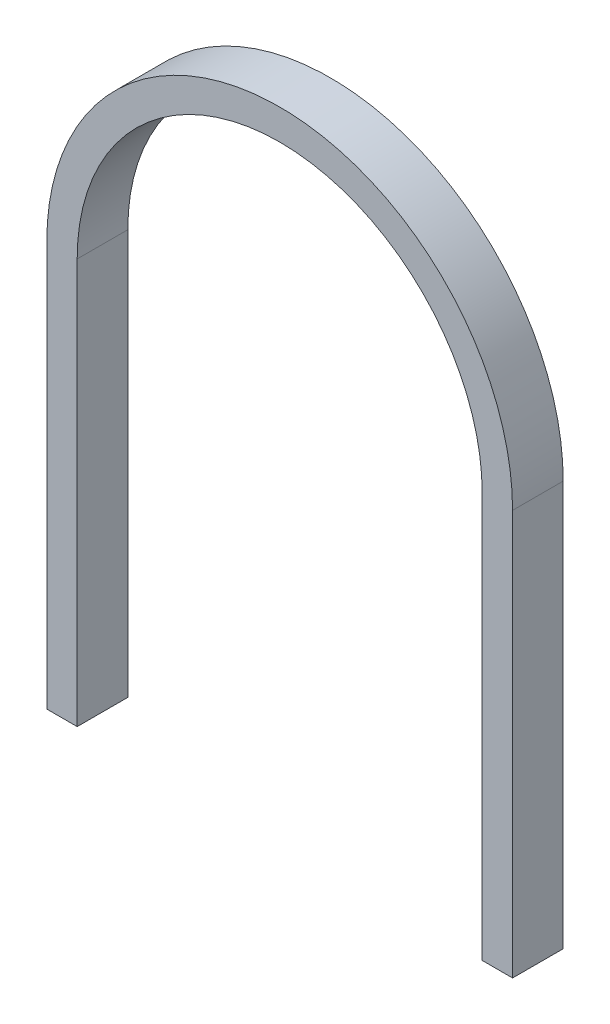
ISO-10303-21;
HEADER;
FILE_DESCRIPTION(('STEP AP214'),'2;1');
FILE_NAME('part.step','',(''),(''),'','','');
FILE_SCHEMA(('AUTOMOTIVE_DESIGN { 1 0 10303 214 1 1 1 1 }'));
ENDSEC;
DATA;
#1=APPLICATION_CONTEXT('core data for automotive mechanical design processes');
#2=APPLICATION_PROTOCOL_DEFINITION('international standard','automotive_design',2000,#1);
#3=PRODUCT_CONTEXT('',#1,'mechanical');
#4=PRODUCT('Part','Part','',(#3));
#5=PRODUCT_RELATED_PRODUCT_CATEGORY('part','',(#4));
#6=PRODUCT_DEFINITION_FORMATION('','',#4);
#7=PRODUCT_DEFINITION_CONTEXT('part definition',#1,'design');
#8=PRODUCT_DEFINITION('design','',#6,#7);
#9=PRODUCT_DEFINITION_SHAPE('','',#8);
#10=(LENGTH_UNIT() NAMED_UNIT(*) SI_UNIT(.MILLI.,.METRE.));
#11=(NAMED_UNIT(*) PLANE_ANGLE_UNIT() SI_UNIT($,.RADIAN.));
#12=(NAMED_UNIT(*) SI_UNIT($,.STERADIAN.) SOLID_ANGLE_UNIT());
#13=UNCERTAINTY_MEASURE_WITH_UNIT(LENGTH_MEASURE(1.E-05),#10,'distance_accuracy_value','');
#14=(GEOMETRIC_REPRESENTATION_CONTEXT(3) GLOBAL_UNCERTAINTY_ASSIGNED_CONTEXT((#13)) GLOBAL_UNIT_ASSIGNED_CONTEXT((#10,
#11,#12)) REPRESENTATION_CONTEXT('',''));
#15=CARTESIAN_POINT('',(0.,0.,0.));
#16=DIRECTION('',(0.,0.,1.));
#17=DIRECTION('',(1.,0.,0.));
#18=AXIS2_PLACEMENT_3D('',#15,#16,#17);
#19=CARTESIAN_POINT('',(-20.,0.,5.));
#20=DIRECTION('',(0.,1.,0.));
#21=DIRECTION('',(-1.,0.,0.));
#22=AXIS2_PLACEMENT_3D('',#19,#20,#21);
#23=PLANE('',#22);
#24=DIRECTION('',(1.,0.,0.));
#25=VECTOR('',#24,1.);
#26=CARTESIAN_POINT('',(-20.,0.,0.));
#27=LINE('',#26,#25);
#28=CARTESIAN_POINT('',(-23.,0.,0.));
#29=VERTEX_POINT('',#28);
#30=CARTESIAN_POINT('',(-20.,0.,0.));
#31=VERTEX_POINT('',#30);
#32=EDGE_CURVE('E129',#29,#31,#27,.T.);
#33=ORIENTED_EDGE('',*,*,#32,.T.);
#34=DIRECTION('',(0.,0.,-1.));
#35=VECTOR('',#34,1.);
#36=CARTESIAN_POINT('',(-20.,0.,5.));
#37=LINE('',#36,#35);
#38=CARTESIAN_POINT('',(-20.,0.,5.));
#39=VERTEX_POINT('',#38);
#40=EDGE_CURVE('E11',#39,#31,#37,.T.);
#41=ORIENTED_EDGE('',*,*,#40,.F.);
#42=DIRECTION('',(1.,0.,0.));
#43=VECTOR('',#42,1.);
#44=CARTESIAN_POINT('',(-20.,0.,5.));
#45=LINE('',#44,#43);
#46=CARTESIAN_POINT('',(-23.,0.,5.));
#47=VERTEX_POINT('',#46);
#48=EDGE_CURVE('E143',#47,#39,#45,.T.);
#49=ORIENTED_EDGE('',*,*,#48,.F.);
#50=DIRECTION('',(0.,0.,-1.));
#51=VECTOR('',#50,1.);
#52=CARTESIAN_POINT('',(-23.,0.,5.));
#53=LINE('',#52,#51);
#54=EDGE_CURVE('E125',#47,#29,#53,.T.);
#55=ORIENTED_EDGE('',*,*,#54,.T.);
#56=EDGE_LOOP('',(#33,#41,#49,#55));
#57=FACE_BOUND('',#56,.T.);
#58=ADVANCED_FACE('F33',(#57),#23,.F.);
#59=CARTESIAN_POINT('',(-20.,0.,5.));
#60=DIRECTION('',(-1.,0.,0.));
#61=DIRECTION('',(0.,-1.,0.));
#62=AXIS2_PLACEMENT_3D('',#59,#60,#61);
#63=PLANE('',#62);
#64=DIRECTION('',(0.,1.,0.));
#65=VECTOR('',#64,1.);
#66=CARTESIAN_POINT('',(-20.,0.,0.));
#67=LINE('',#66,#65);
#68=CARTESIAN_POINT('',(-20.,40.,0.));
#69=VERTEX_POINT('',#68);
#70=EDGE_CURVE('E132',#31,#69,#67,.T.);
#71=ORIENTED_EDGE('',*,*,#70,.T.);
#72=DIRECTION('',(0.,0.,-1.));
#73=VECTOR('',#72,1.);
#74=CARTESIAN_POINT('',(-20.,40.,5.));
#75=LINE('',#74,#73);
#76=CARTESIAN_POINT('',(-20.,40.,5.));
#77=VERTEX_POINT('',#76);
#78=EDGE_CURVE('E41',#77,#69,#75,.T.);
#79=ORIENTED_EDGE('',*,*,#78,.F.);
#80=DIRECTION('',(0.,1.,0.));
#81=VECTOR('',#80,1.);
#82=CARTESIAN_POINT('',(-20.,0.,5.));
#83=LINE('',#82,#81);
#84=EDGE_CURVE('E92',#39,#77,#83,.T.);
#85=ORIENTED_EDGE('',*,*,#84,.F.);
#86=ORIENTED_EDGE('',*,*,#40,.T.);
#87=EDGE_LOOP('',(#71,#79,#85,#86));
#88=FACE_BOUND('',#87,.T.);
#89=ADVANCED_FACE('F178',(#88),#63,.F.);
#90=CARTESIAN_POINT('',(0.,40.,5.));
#91=DIRECTION('',(0.,0.,-1.));
#92=DIRECTION('',(-1.,0.,0.));
#93=AXIS2_PLACEMENT_3D('',#90,#91,#92);
#94=CYLINDRICAL_SURFACE('',#93,20.);
#95=CARTESIAN_POINT('',(0.,40.,0.));
#96=DIRECTION('',(0.,0.,-1.));
#97=DIRECTION('',(-1.,0.,0.));
#98=AXIS2_PLACEMENT_3D('',#95,#96,#97);
#99=CIRCLE('',#98,20.);
#100=CARTESIAN_POINT('',(20.,40.,0.));
#101=VERTEX_POINT('',#100);
#102=EDGE_CURVE('E134',#69,#101,#99,.T.);
#103=ORIENTED_EDGE('',*,*,#102,.T.);
#104=DIRECTION('',(0.,0.,-1.));
#105=VECTOR('',#104,1.);
#106=CARTESIAN_POINT('',(20.,40.,5.));
#107=LINE('',#106,#105);
#108=CARTESIAN_POINT('',(20.,40.,5.));
#109=VERTEX_POINT('',#108);
#110=EDGE_CURVE('E150',#109,#101,#107,.T.);
#111=ORIENTED_EDGE('',*,*,#110,.F.);
#112=CARTESIAN_POINT('',(0.,40.,5.));
#113=DIRECTION('',(0.,0.,-1.));
#114=DIRECTION('',(-1.,0.,0.));
#115=AXIS2_PLACEMENT_3D('',#112,#113,#114);
#116=CIRCLE('',#115,20.);
#117=EDGE_CURVE('E158',#77,#109,#116,.T.);
#118=ORIENTED_EDGE('',*,*,#117,.F.);
#119=ORIENTED_EDGE('',*,*,#78,.T.);
#120=EDGE_LOOP('',(#103,#111,#118,#119));
#121=FACE_BOUND('',#120,.T.);
#122=ADVANCED_FACE('F156',(#121),#94,.F.);
#123=CARTESIAN_POINT('',(20.,40.,5.));
#124=DIRECTION('',(1.,0.,0.));
#125=DIRECTION('',(0.,1.,0.));
#126=AXIS2_PLACEMENT_3D('',#123,#124,#125);
#127=PLANE('',#126);
#128=DIRECTION('',(0.,-1.,0.));
#129=VECTOR('',#128,1.);
#130=CARTESIAN_POINT('',(20.,40.,0.));
#131=LINE('',#130,#129);
#132=CARTESIAN_POINT('',(20.,0.,0.));
#133=VERTEX_POINT('',#132);
#134=EDGE_CURVE('E136',#101,#133,#131,.T.);
#135=ORIENTED_EDGE('',*,*,#134,.T.);
#136=DIRECTION('',(0.,0.,-1.));
#137=VECTOR('',#136,1.);
#138=CARTESIAN_POINT('',(20.,0.,5.));
#139=LINE('',#138,#137);
#140=CARTESIAN_POINT('',(20.,0.,5.));
#141=VERTEX_POINT('',#140);
#142=EDGE_CURVE('E147',#141,#133,#139,.T.);
#143=ORIENTED_EDGE('',*,*,#142,.F.);
#144=DIRECTION('',(0.,-1.,0.));
#145=VECTOR('',#144,1.);
#146=CARTESIAN_POINT('',(20.,40.,5.));
#147=LINE('',#146,#145);
#148=EDGE_CURVE('E170',#109,#141,#147,.T.);
#149=ORIENTED_EDGE('',*,*,#148,.F.);
#150=ORIENTED_EDGE('',*,*,#110,.T.);
#151=EDGE_LOOP('',(#135,#143,#149,#150));
#152=FACE_BOUND('',#151,.T.);
#153=ADVANCED_FACE('F166',(#152),#127,.F.);
#154=CARTESIAN_POINT('',(20.,0.,5.));
#155=DIRECTION('',(0.,1.,0.));
#156=DIRECTION('',(-1.,0.,0.));
#157=AXIS2_PLACEMENT_3D('',#154,#155,#156);
#158=PLANE('',#157);
#159=DIRECTION('',(1.,0.,0.));
#160=VECTOR('',#159,1.);
#161=CARTESIAN_POINT('',(20.,0.,0.));
#162=LINE('',#161,#160);
#163=CARTESIAN_POINT('',(23.,0.,0.));
#164=VERTEX_POINT('',#163);
#165=EDGE_CURVE('E138',#133,#164,#162,.T.);
#166=ORIENTED_EDGE('',*,*,#165,.T.);
#167=DIRECTION('',(0.,0.,-1.));
#168=VECTOR('',#167,1.);
#169=CARTESIAN_POINT('',(23.,0.,5.));
#170=LINE('',#169,#168);
#171=CARTESIAN_POINT('',(23.,0.,5.));
#172=VERTEX_POINT('',#171);
#173=EDGE_CURVE('E120',#172,#164,#170,.T.);
#174=ORIENTED_EDGE('',*,*,#173,.F.);
#175=DIRECTION('',(1.,0.,0.));
#176=VECTOR('',#175,1.);
#177=CARTESIAN_POINT('',(20.,0.,5.));
#178=LINE('',#177,#176);
#179=EDGE_CURVE('E111',#141,#172,#178,.T.);
#180=ORIENTED_EDGE('',*,*,#179,.F.);
#181=ORIENTED_EDGE('',*,*,#142,.T.);
#182=EDGE_LOOP('',(#166,#174,#180,#181));
#183=FACE_BOUND('',#182,.T.);
#184=ADVANCED_FACE('F169',(#183),#158,.F.);
#185=CARTESIAN_POINT('',(23.,0.,5.));
#186=DIRECTION('',(-1.,0.,0.));
#187=DIRECTION('',(0.,0.,1.));
#188=AXIS2_PLACEMENT_3D('',#185,#186,#187);
#189=PLANE('',#188);
#190=DIRECTION('',(0.,1.,0.));
#191=VECTOR('',#190,1.);
#192=CARTESIAN_POINT('',(23.,0.,0.));
#193=LINE('',#192,#191);
#194=CARTESIAN_POINT('',(23.,40.,0.));
#195=VERTEX_POINT('',#194);
#196=EDGE_CURVE('E119',#164,#195,#193,.T.);
#197=ORIENTED_EDGE('',*,*,#196,.T.);
#198=DIRECTION('',(0.,0.,-1.));
#199=VECTOR('',#198,1.);
#200=CARTESIAN_POINT('',(23.,40.,5.));
#201=LINE('',#200,#199);
#202=CARTESIAN_POINT('',(23.,40.,5.));
#203=VERTEX_POINT('',#202);
#204=EDGE_CURVE('E116',#203,#195,#201,.T.);
#205=ORIENTED_EDGE('',*,*,#204,.F.);
#206=DIRECTION('',(0.,1.,0.));
#207=VECTOR('',#206,1.);
#208=CARTESIAN_POINT('',(23.,0.,5.));
#209=LINE('',#208,#207);
#210=EDGE_CURVE('E105',#172,#203,#209,.T.);
#211=ORIENTED_EDGE('',*,*,#210,.F.);
#212=ORIENTED_EDGE('',*,*,#173,.T.);
#213=EDGE_LOOP('',(#197,#205,#211,#212));
#214=FACE_BOUND('',#213,.T.);
#215=ADVANCED_FACE('F117',(#214),#189,.F.);
#216=CARTESIAN_POINT('',(0.,40.,5.));
#217=DIRECTION('',(0.,0.,-1.));
#218=DIRECTION('',(-1.,0.,0.));
#219=AXIS2_PLACEMENT_3D('',#216,#217,#218);
#220=CYLINDRICAL_SURFACE('',#219,23.);
#221=CARTESIAN_POINT('',(0.,40.,0.));
#222=DIRECTION('',(0.,0.,1.));
#223=DIRECTION('',(1.,0.,0.));
#224=AXIS2_PLACEMENT_3D('',#221,#222,#223);
#225=CIRCLE('',#224,23.);
#226=CARTESIAN_POINT('',(-23.,40.,0.));
#227=VERTEX_POINT('',#226);
#228=EDGE_CURVE('E78',#195,#227,#225,.T.);
#229=ORIENTED_EDGE('',*,*,#228,.T.);
#230=DIRECTION('',(0.,0.,-1.));
#231=VECTOR('',#230,1.);
#232=CARTESIAN_POINT('',(-23.,40.,5.));
#233=LINE('',#232,#231);
#234=CARTESIAN_POINT('',(-23.,40.,5.));
#235=VERTEX_POINT('',#234);
#236=EDGE_CURVE('E121',#235,#227,#233,.T.);
#237=ORIENTED_EDGE('',*,*,#236,.F.);
#238=CARTESIAN_POINT('',(0.,40.,5.));
#239=DIRECTION('',(0.,0.,1.));
#240=DIRECTION('',(1.,0.,0.));
#241=AXIS2_PLACEMENT_3D('',#238,#239,#240);
#242=CIRCLE('',#241,23.);
#243=EDGE_CURVE('E109',#203,#235,#242,.T.);
#244=ORIENTED_EDGE('',*,*,#243,.F.);
#245=ORIENTED_EDGE('',*,*,#204,.T.);
#246=EDGE_LOOP('',(#229,#237,#244,#245));
#247=FACE_BOUND('',#246,.T.);
#248=ADVANCED_FACE('F123',(#247),#220,.T.);
#249=CARTESIAN_POINT('',(-23.,0.,5.));
#250=DIRECTION('',(1.,0.,0.));
#251=DIRECTION('',(0.,0.,-1.));
#252=AXIS2_PLACEMENT_3D('',#249,#250,#251);
#253=PLANE('',#252);
#254=DIRECTION('',(0.,-1.,0.));
#255=VECTOR('',#254,1.);
#256=CARTESIAN_POINT('',(-23.,0.,0.));
#257=LINE('',#256,#255);
#258=EDGE_CURVE('E84',#227,#29,#257,.T.);
#259=ORIENTED_EDGE('',*,*,#258,.T.);
#260=ORIENTED_EDGE('',*,*,#54,.F.);
#261=DIRECTION('',(0.,-1.,0.));
#262=VECTOR('',#261,1.);
#263=CARTESIAN_POINT('',(-23.,0.,5.));
#264=LINE('',#263,#262);
#265=EDGE_CURVE('E49',#235,#47,#264,.T.);
#266=ORIENTED_EDGE('',*,*,#265,.F.);
#267=ORIENTED_EDGE('',*,*,#236,.T.);
#268=EDGE_LOOP('',(#259,#260,#266,#267));
#269=FACE_BOUND('',#268,.T.);
#270=ADVANCED_FACE('F194',(#269),#253,.F.);
#271=CARTESIAN_POINT('',(0.,40.,5.));
#272=DIRECTION('',(0.,0.,1.));
#273=DIRECTION('',(1.,0.,0.));
#274=AXIS2_PLACEMENT_3D('',#271,#272,#273);
#275=PLANE('',#274);
#276=ORIENTED_EDGE('',*,*,#48,.T.);
#277=ORIENTED_EDGE('',*,*,#84,.T.);
#278=ORIENTED_EDGE('',*,*,#117,.T.);
#279=ORIENTED_EDGE('',*,*,#148,.T.);
#280=ORIENTED_EDGE('',*,*,#179,.T.);
#281=ORIENTED_EDGE('',*,*,#210,.T.);
#282=ORIENTED_EDGE('',*,*,#243,.T.);
#283=ORIENTED_EDGE('',*,*,#265,.T.);
#284=EDGE_LOOP('',(#276,#277,#278,#279,#280,#281,#282,#283));
#285=FACE_BOUND('',#284,.T.);
#286=ADVANCED_FACE('F107',(#285),#275,.T.);
#287=CARTESIAN_POINT('',(0.,40.,0.));
#288=DIRECTION('',(0.,0.,1.));
#289=DIRECTION('',(1.,0.,0.));
#290=AXIS2_PLACEMENT_3D('',#287,#288,#289);
#291=PLANE('',#290);
#292=ORIENTED_EDGE('',*,*,#32,.F.);
#293=ORIENTED_EDGE('',*,*,#258,.F.);
#294=ORIENTED_EDGE('',*,*,#228,.F.);
#295=ORIENTED_EDGE('',*,*,#196,.F.);
#296=ORIENTED_EDGE('',*,*,#165,.F.);
#297=ORIENTED_EDGE('',*,*,#134,.F.);
#298=ORIENTED_EDGE('',*,*,#102,.F.);
#299=ORIENTED_EDGE('',*,*,#70,.F.);
#300=EDGE_LOOP('',(#292,#293,#294,#295,#296,#297,#298,#299));
#301=FACE_BOUND('',#300,.T.);
#302=ADVANCED_FACE('F162',(#301),#291,.F.);
#303=CLOSED_SHELL('',(#58,#89,#122,#153,#184,#215,#248,#270,#286,#302));
#304=MANIFOLD_SOLID_BREP('B2',#303);
#305=ADVANCED_BREP_SHAPE_REPRESENTATION('',(#18,#304),#14);
#306=SHAPE_DEFINITION_REPRESENTATION(#9,#305);
ENDSEC;
END-ISO-10303-21;
